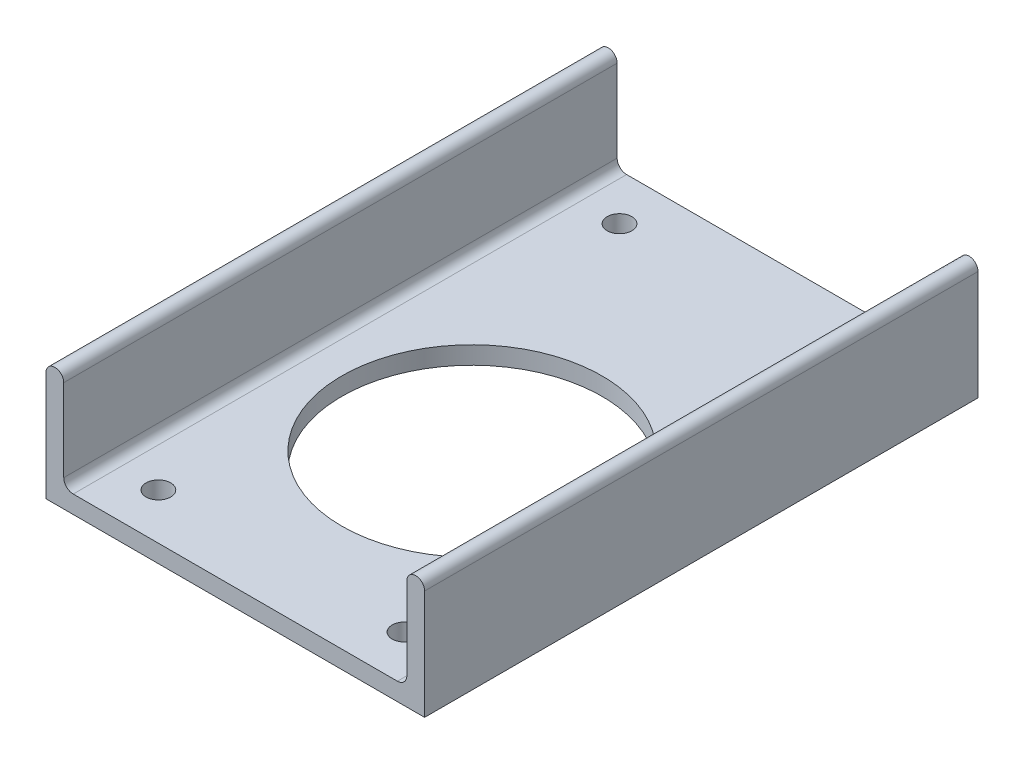
ISO-10303-21;
HEADER;
FILE_DESCRIPTION(('STEP AP214'),'2;1');
FILE_NAME('part.step','',(''),(''),'','','');
FILE_SCHEMA(('AUTOMOTIVE_DESIGN { 1 0 10303 214 1 1 1 1 }'));
ENDSEC;
DATA;
#1=APPLICATION_CONTEXT('core data for automotive mechanical design processes');
#2=APPLICATION_PROTOCOL_DEFINITION('international standard','automotive_design',2000,#1);
#3=PRODUCT_CONTEXT('',#1,'mechanical');
#4=PRODUCT('Part','Part','',(#3));
#5=PRODUCT_RELATED_PRODUCT_CATEGORY('part','',(#4));
#6=PRODUCT_DEFINITION_FORMATION('','',#4);
#7=PRODUCT_DEFINITION_CONTEXT('part definition',#1,'design');
#8=PRODUCT_DEFINITION('design','',#6,#7);
#9=PRODUCT_DEFINITION_SHAPE('','',#8);
#10=(LENGTH_UNIT() NAMED_UNIT(*) SI_UNIT(.MILLI.,.METRE.));
#11=(NAMED_UNIT(*) PLANE_ANGLE_UNIT() SI_UNIT($,.RADIAN.));
#12=(NAMED_UNIT(*) SI_UNIT($,.STERADIAN.) SOLID_ANGLE_UNIT());
#13=UNCERTAINTY_MEASURE_WITH_UNIT(LENGTH_MEASURE(1.E-05),#10,'distance_accuracy_value','');
#14=(GEOMETRIC_REPRESENTATION_CONTEXT(3) GLOBAL_UNCERTAINTY_ASSIGNED_CONTEXT((#13)) GLOBAL_UNIT_ASSIGNED_CONTEXT((#10,
#11,#12)) REPRESENTATION_CONTEXT('',''));
#15=CARTESIAN_POINT('',(0.,0.,0.));
#16=DIRECTION('',(0.,0.,1.));
#17=DIRECTION('',(1.,0.,0.));
#18=AXIS2_PLACEMENT_3D('',#15,#16,#17);
#19=CARTESIAN_POINT('',(-48.41875,29.36875,0.));
#20=DIRECTION('',(0.,0.,-1.));
#21=DIRECTION('',(-1.,0.,0.));
#22=AXIS2_PLACEMENT_3D('',#19,#20,#21);
#23=CYLINDRICAL_SURFACE('',#22,2.38125);
#24=DIRECTION('',(0.,0.,1.));
#25=VECTOR('',#24,1.);
#26=CARTESIAN_POINT('',(-46.0375,29.36875,0.));
#27=LINE('',#26,#25);
#28=CARTESIAN_POINT('',(-46.0375,29.36875,-74.25436));
#29=VERTEX_POINT('',#28);
#30=CARTESIAN_POINT('',(-46.0375,29.36875,74.25436));
#31=VERTEX_POINT('',#30);
#32=EDGE_CURVE('E227',#29,#31,#27,.T.);
#33=ORIENTED_EDGE('',*,*,#32,.F.);
#34=CARTESIAN_POINT('',(-48.41875,29.36875,-74.25436));
#35=DIRECTION('',(0.,0.,-1.));
#36=DIRECTION('',(-1.,0.,0.));
#37=AXIS2_PLACEMENT_3D('',#34,#35,#36);
#38=CIRCLE('',#37,2.38125);
#39=CARTESIAN_POINT('',(-50.8,29.36875,-74.25436));
#40=VERTEX_POINT('',#39);
#41=EDGE_CURVE('E204',#29,#40,#38,.F.);
#42=ORIENTED_EDGE('',*,*,#41,.T.);
#43=DIRECTION('',(0.,0.,-1.));
#44=VECTOR('',#43,1.);
#45=CARTESIAN_POINT('',(-50.8,29.36875,74.25436));
#46=LINE('',#45,#44);
#47=CARTESIAN_POINT('',(-50.8,29.36875,74.25436));
#48=VERTEX_POINT('',#47);
#49=EDGE_CURVE('E231',#48,#40,#46,.T.);
#50=ORIENTED_EDGE('',*,*,#49,.F.);
#51=CARTESIAN_POINT('',(-48.41875,29.36875,74.25436));
#52=DIRECTION('',(0.,0.,-1.));
#53=DIRECTION('',(-1.,0.,0.));
#54=AXIS2_PLACEMENT_3D('',#51,#52,#53);
#55=CIRCLE('',#54,2.38125);
#56=EDGE_CURVE('E234',#31,#48,#55,.F.);
#57=ORIENTED_EDGE('',*,*,#56,.F.);
#58=EDGE_LOOP('',(#33,#42,#50,#57));
#59=FACE_BOUND('',#58,.T.);
#60=ADVANCED_FACE('F48',(#59),#23,.T.);
#61=CARTESIAN_POINT('',(-46.0375,0.,74.25436));
#62=DIRECTION('',(-1.,0.,0.));
#63=DIRECTION('',(0.,0.,1.));
#64=AXIS2_PLACEMENT_3D('',#61,#62,#63);
#65=PLANE('',#64);
#66=DIRECTION('',(0.,1.,0.));
#67=VECTOR('',#66,1.);
#68=CARTESIAN_POINT('',(-46.0375,0.,74.25436));
#69=LINE('',#68,#67);
#70=CARTESIAN_POINT('',(-46.0375,7.3025,74.25436));
#71=VERTEX_POINT('',#70);
#72=EDGE_CURVE('E212',#71,#31,#69,.T.);
#73=ORIENTED_EDGE('',*,*,#72,.F.);
#74=DIRECTION('',(0.,0.,-1.));
#75=VECTOR('',#74,1.);
#76=CARTESIAN_POINT('',(-46.0375,7.3025,0.));
#77=LINE('',#76,#75);
#78=CARTESIAN_POINT('',(-46.0375,7.3025,-74.25436));
#79=VERTEX_POINT('',#78);
#80=EDGE_CURVE('E237',#71,#79,#77,.T.);
#81=ORIENTED_EDGE('',*,*,#80,.T.);
#82=DIRECTION('',(0.,1.,0.));
#83=VECTOR('',#82,1.);
#84=CARTESIAN_POINT('',(-46.0375,0.,-74.25436));
#85=LINE('',#84,#83);
#86=EDGE_CURVE('E196',#79,#29,#85,.T.);
#87=ORIENTED_EDGE('',*,*,#86,.T.);
#88=ORIENTED_EDGE('',*,*,#32,.T.);
#89=EDGE_LOOP('',(#73,#81,#87,#88));
#90=FACE_BOUND('',#89,.T.);
#91=ADVANCED_FACE('F290',(#90),#65,.F.);
#92=CARTESIAN_POINT('',(-50.8,0.,74.25436));
#93=DIRECTION('',(-1.,0.,0.));
#94=DIRECTION('',(0.,0.,1.));
#95=AXIS2_PLACEMENT_3D('',#92,#93,#94);
#96=PLANE('',#95);
#97=DIRECTION('',(0.,1.,0.));
#98=VECTOR('',#97,1.);
#99=CARTESIAN_POINT('',(-50.8,0.,74.25436));
#100=LINE('',#99,#98);
#101=CARTESIAN_POINT('',(-50.8,0.,74.25436));
#102=VERTEX_POINT('',#101);
#103=EDGE_CURVE('E215',#102,#48,#100,.T.);
#104=ORIENTED_EDGE('',*,*,#103,.T.);
#105=ORIENTED_EDGE('',*,*,#49,.T.);
#106=DIRECTION('',(0.,1.,0.));
#107=VECTOR('',#106,1.);
#108=CARTESIAN_POINT('',(-50.8,0.,-74.25436));
#109=LINE('',#108,#107);
#110=CARTESIAN_POINT('',(-50.8,0.,-74.25436));
#111=VERTEX_POINT('',#110);
#112=EDGE_CURVE('E138',#111,#40,#109,.T.);
#113=ORIENTED_EDGE('',*,*,#112,.F.);
#114=DIRECTION('',(0.,0.,-1.));
#115=VECTOR('',#114,1.);
#116=CARTESIAN_POINT('',(-50.8,0.,74.25436));
#117=LINE('',#116,#115);
#118=EDGE_CURVE('E131',#102,#111,#117,.T.);
#119=ORIENTED_EDGE('',*,*,#118,.F.);
#120=EDGE_LOOP('',(#104,#105,#113,#119));
#121=FACE_BOUND('',#120,.T.);
#122=ADVANCED_FACE('F295',(#121),#96,.T.);
#123=CARTESIAN_POINT('',(0.,0.,74.25436));
#124=DIRECTION('',(0.,-1.,0.));
#125=DIRECTION('',(0.,0.,-1.));
#126=AXIS2_PLACEMENT_3D('',#123,#124,#125);
#127=PLANE('',#126);
#128=CARTESIAN_POINT('',(0.,0.,10.75436));
#129=DIRECTION('',(0.,1.,0.));
#130=DIRECTION('',(0.,0.,1.));
#131=AXIS2_PLACEMENT_3D('',#128,#129,#130);
#132=CIRCLE('',#131,34.925);
#133=CARTESIAN_POINT('',(0.,0.,45.67936));
#134=VERTEX_POINT('',#133);
#135=EDGE_CURVE('E500',#134,#134,#132,.T.);
#136=ORIENTED_EDGE('',*,*,#135,.T.);
#137=EDGE_LOOP('',(#136));
#138=FACE_BOUND('',#137,.T.);
#139=CARTESIAN_POINT('',(-33.02,0.,61.87186));
#140=DIRECTION('',(0.,-1.,0.));
#141=DIRECTION('',(0.,0.,-1.));
#142=AXIS2_PLACEMENT_3D('',#139,#140,#141);
#143=CIRCLE('',#142,3.29999999999999);
#144=CARTESIAN_POINT('',(-33.02,0.,58.57186));
#145=VERTEX_POINT('',#144);
#146=EDGE_CURVE('E509',#145,#145,#143,.T.);
#147=ORIENTED_EDGE('',*,*,#146,.F.);
#148=EDGE_LOOP('',(#147));
#149=FACE_BOUND('',#148,.T.);
#150=CARTESIAN_POINT('',(33.02,0.,61.87186));
#151=DIRECTION('',(0.,-1.,0.));
#152=DIRECTION('',(0.,0.,-1.));
#153=AXIS2_PLACEMENT_3D('',#150,#151,#152);
#154=CIRCLE('',#153,3.29999999999999);
#155=CARTESIAN_POINT('',(33.02,0.,58.57186));
#156=VERTEX_POINT('',#155);
#157=EDGE_CURVE('E264',#156,#156,#154,.T.);
#158=ORIENTED_EDGE('',*,*,#157,.F.);
#159=EDGE_LOOP('',(#158));
#160=FACE_BOUND('',#159,.T.);
#161=CARTESIAN_POINT('',(-33.02,0.,-61.87186));
#162=DIRECTION('',(0.,-1.,0.));
#163=DIRECTION('',(0.,0.,-1.));
#164=AXIS2_PLACEMENT_3D('',#161,#162,#163);
#165=CIRCLE('',#164,3.29999999999999);
#166=CARTESIAN_POINT('',(-33.02,0.,-65.17186));
#167=VERTEX_POINT('',#166);
#168=EDGE_CURVE('E245',#167,#167,#165,.T.);
#169=ORIENTED_EDGE('',*,*,#168,.F.);
#170=EDGE_LOOP('',(#169));
#171=FACE_BOUND('',#170,.T.);
#172=CARTESIAN_POINT('',(33.02,0.,-61.87186));
#173=DIRECTION('',(0.,-1.,0.));
#174=DIRECTION('',(0.,0.,-1.));
#175=AXIS2_PLACEMENT_3D('',#172,#173,#174);
#176=CIRCLE('',#175,3.29999999999999);
#177=CARTESIAN_POINT('',(33.02,0.,-65.17186));
#178=VERTEX_POINT('',#177);
#179=EDGE_CURVE('E244',#178,#178,#176,.T.);
#180=ORIENTED_EDGE('',*,*,#179,.F.);
#181=EDGE_LOOP('',(#180));
#182=FACE_BOUND('',#181,.T.);
#183=ORIENTED_EDGE('',*,*,#118,.T.);
#184=DIRECTION('',(-1.,0.,0.));
#185=VECTOR('',#184,1.);
#186=CARTESIAN_POINT('',(0.,0.,-74.25436));
#187=LINE('',#186,#185);
#188=CARTESIAN_POINT('',(50.8,0.,-74.25436));
#189=VERTEX_POINT('',#188);
#190=EDGE_CURVE('E125',#189,#111,#187,.T.);
#191=ORIENTED_EDGE('',*,*,#190,.F.);
#192=DIRECTION('',(0.,0.,-1.));
#193=VECTOR('',#192,1.);
#194=CARTESIAN_POINT('',(50.8,0.,74.25436));
#195=LINE('',#194,#193);
#196=CARTESIAN_POINT('',(50.8,0.,74.25436));
#197=VERTEX_POINT('',#196);
#198=EDGE_CURVE('E129',#197,#189,#195,.T.);
#199=ORIENTED_EDGE('',*,*,#198,.F.);
#200=DIRECTION('',(-1.,0.,0.));
#201=VECTOR('',#200,1.);
#202=CARTESIAN_POINT('',(0.,0.,74.25436));
#203=LINE('',#202,#201);
#204=EDGE_CURVE('E219',#197,#102,#203,.T.);
#205=ORIENTED_EDGE('',*,*,#204,.T.);
#206=EDGE_LOOP('',(#183,#191,#199,#205));
#207=FACE_BOUND('',#206,.T.);
#208=ADVANCED_FACE('F127',(#138,#149,#160,#171,#182,#207),#127,.T.);
#209=CARTESIAN_POINT('',(0.,4.7625,74.25436));
#210=DIRECTION('',(0.,-1.,0.));
#211=DIRECTION('',(0.,0.,-1.));
#212=AXIS2_PLACEMENT_3D('',#209,#210,#211);
#213=PLANE('',#212);
#214=CARTESIAN_POINT('',(0.,4.7625,10.75436));
#215=DIRECTION('',(0.,1.,0.));
#216=DIRECTION('',(0.,0.,1.));
#217=AXIS2_PLACEMENT_3D('',#214,#215,#216);
#218=CIRCLE('',#217,34.925);
#219=CARTESIAN_POINT('',(0.,4.7625,45.67936));
#220=VERTEX_POINT('',#219);
#221=EDGE_CURVE('E503',#220,#220,#218,.T.);
#222=ORIENTED_EDGE('',*,*,#221,.F.);
#223=EDGE_LOOP('',(#222));
#224=FACE_BOUND('',#223,.T.);
#225=CARTESIAN_POINT('',(-33.02,4.7625,61.87186));
#226=DIRECTION('',(0.,-1.,0.));
#227=DIRECTION('',(0.,0.,-1.));
#228=AXIS2_PLACEMENT_3D('',#225,#226,#227);
#229=CIRCLE('',#228,3.29999999999999);
#230=CARTESIAN_POINT('',(-33.02,4.7625,58.57186));
#231=VERTEX_POINT('',#230);
#232=EDGE_CURVE('E52',#231,#231,#229,.T.);
#233=ORIENTED_EDGE('',*,*,#232,.T.);
#234=EDGE_LOOP('',(#233));
#235=FACE_BOUND('',#234,.T.);
#236=CARTESIAN_POINT('',(33.02,4.7625,61.87186));
#237=DIRECTION('',(0.,-1.,0.));
#238=DIRECTION('',(0.,0.,-1.));
#239=AXIS2_PLACEMENT_3D('',#236,#237,#238);
#240=CIRCLE('',#239,3.29999999999999);
#241=CARTESIAN_POINT('',(33.02,4.7625,58.57186));
#242=VERTEX_POINT('',#241);
#243=EDGE_CURVE('E255',#242,#242,#240,.T.);
#244=ORIENTED_EDGE('',*,*,#243,.T.);
#245=EDGE_LOOP('',(#244));
#246=FACE_BOUND('',#245,.T.);
#247=CARTESIAN_POINT('',(-33.02,4.7625,-61.87186));
#248=DIRECTION('',(0.,-1.,0.));
#249=DIRECTION('',(0.,0.,-1.));
#250=AXIS2_PLACEMENT_3D('',#247,#248,#249);
#251=CIRCLE('',#250,3.29999999999999);
#252=CARTESIAN_POINT('',(-33.02,4.7625,-65.17186));
#253=VERTEX_POINT('',#252);
#254=EDGE_CURVE('E241',#253,#253,#251,.T.);
#255=ORIENTED_EDGE('',*,*,#254,.T.);
#256=EDGE_LOOP('',(#255));
#257=FACE_BOUND('',#256,.T.);
#258=CARTESIAN_POINT('',(33.02,4.7625,-61.87186));
#259=DIRECTION('',(0.,-1.,0.));
#260=DIRECTION('',(0.,0.,-1.));
#261=AXIS2_PLACEMENT_3D('',#258,#259,#260);
#262=CIRCLE('',#261,3.29999999999999);
#263=CARTESIAN_POINT('',(33.02,4.7625,-65.17186));
#264=VERTEX_POINT('',#263);
#265=EDGE_CURVE('E165',#264,#264,#262,.T.);
#266=ORIENTED_EDGE('',*,*,#265,.T.);
#267=EDGE_LOOP('',(#266));
#268=FACE_BOUND('',#267,.T.);
#269=DIRECTION('',(1.,0.,0.));
#270=VECTOR('',#269,1.);
#271=CARTESIAN_POINT('',(0.,4.7625,74.25436));
#272=LINE('',#271,#270);
#273=CARTESIAN_POINT('',(43.4975,4.7625,74.25436));
#274=VERTEX_POINT('',#273);
#275=CARTESIAN_POINT('',(-43.4975,4.7625,74.25436));
#276=VERTEX_POINT('',#275);
#277=EDGE_CURVE('E222',#274,#276,#272,.F.);
#278=ORIENTED_EDGE('',*,*,#277,.F.);
#279=DIRECTION('',(0.,0.,-1.));
#280=VECTOR('',#279,1.);
#281=CARTESIAN_POINT('',(43.4975,4.7625,74.25436));
#282=LINE('',#281,#280);
#283=CARTESIAN_POINT('',(43.4975,4.7625,-74.25436));
#284=VERTEX_POINT('',#283);
#285=EDGE_CURVE('E189',#284,#274,#282,.F.);
#286=ORIENTED_EDGE('',*,*,#285,.F.);
#287=DIRECTION('',(1.,0.,0.));
#288=VECTOR('',#287,1.);
#289=CARTESIAN_POINT('',(0.,4.7625,-74.25436));
#290=LINE('',#289,#288);
#291=CARTESIAN_POINT('',(-43.4975,4.7625,-74.25436));
#292=VERTEX_POINT('',#291);
#293=EDGE_CURVE('E137',#284,#292,#290,.F.);
#294=ORIENTED_EDGE('',*,*,#293,.T.);
#295=DIRECTION('',(0.,0.,-1.));
#296=VECTOR('',#295,1.);
#297=CARTESIAN_POINT('',(-43.4975,4.7625,74.25436));
#298=LINE('',#297,#296);
#299=EDGE_CURVE('E58',#292,#276,#298,.F.);
#300=ORIENTED_EDGE('',*,*,#299,.T.);
#301=EDGE_LOOP('',(#278,#286,#294,#300));
#302=FACE_BOUND('',#301,.T.);
#303=ADVANCED_FACE('F272',(#224,#235,#246,#257,#268,#302),#213,.F.);
#304=CARTESIAN_POINT('',(0.,0.,74.25436));
#305=DIRECTION('',(0.,0.,-1.));
#306=DIRECTION('',(-1.,0.,0.));
#307=AXIS2_PLACEMENT_3D('',#304,#305,#306);
#308=PLANE('',#307);
#309=ORIENTED_EDGE('',*,*,#277,.T.);
#310=CARTESIAN_POINT('',(-43.4975,7.3025,74.25436));
#311=DIRECTION('',(0.,0.,-1.));
#312=DIRECTION('',(-1.,0.,0.));
#313=AXIS2_PLACEMENT_3D('',#310,#311,#312);
#314=CIRCLE('',#313,2.54);
#315=EDGE_CURVE('E11',#276,#71,#314,.T.);
#316=ORIENTED_EDGE('',*,*,#315,.T.);
#317=ORIENTED_EDGE('',*,*,#72,.T.);
#318=ORIENTED_EDGE('',*,*,#56,.T.);
#319=ORIENTED_EDGE('',*,*,#103,.F.);
#320=ORIENTED_EDGE('',*,*,#204,.F.);
#321=DIRECTION('',(0.,1.,0.));
#322=VECTOR('',#321,1.);
#323=CARTESIAN_POINT('',(50.8,0.,74.25436));
#324=LINE('',#323,#322);
#325=CARTESIAN_POINT('',(50.8,29.36875,74.25436));
#326=VERTEX_POINT('',#325);
#327=EDGE_CURVE('E146',#197,#326,#324,.T.);
#328=ORIENTED_EDGE('',*,*,#327,.T.);
#329=CARTESIAN_POINT('',(48.41875,29.36875,74.25436));
#330=DIRECTION('',(0.,0.,1.));
#331=DIRECTION('',(1.,0.,0.));
#332=AXIS2_PLACEMENT_3D('',#329,#330,#331);
#333=CIRCLE('',#332,2.38125);
#334=CARTESIAN_POINT('',(46.0375,29.36875,74.25436));
#335=VERTEX_POINT('',#334);
#336=EDGE_CURVE('E182',#335,#326,#333,.F.);
#337=ORIENTED_EDGE('',*,*,#336,.F.);
#338=DIRECTION('',(0.,1.,0.));
#339=VECTOR('',#338,1.);
#340=CARTESIAN_POINT('',(46.0375,0.,74.25436));
#341=LINE('',#340,#339);
#342=CARTESIAN_POINT('',(46.0375,7.3025,74.25436));
#343=VERTEX_POINT('',#342);
#344=EDGE_CURVE('E172',#343,#335,#341,.T.);
#345=ORIENTED_EDGE('',*,*,#344,.F.);
#346=CARTESIAN_POINT('',(43.4975,7.3025,74.25436));
#347=DIRECTION('',(0.,0.,1.));
#348=DIRECTION('',(1.,0.,0.));
#349=AXIS2_PLACEMENT_3D('',#346,#347,#348);
#350=CIRCLE('',#349,2.54);
#351=EDGE_CURVE('E193',#274,#343,#350,.T.);
#352=ORIENTED_EDGE('',*,*,#351,.F.);
#353=EDGE_LOOP('',(#309,#316,#317,#318,#319,#320,#328,#337,#345,#352));
#354=FACE_BOUND('',#353,.T.);
#355=ADVANCED_FACE('F310',(#354),#308,.F.);
#356=CARTESIAN_POINT('',(-43.4975,7.3025,74.25436));
#357=DIRECTION('',(0.,0.,1.));
#358=DIRECTION('',(1.,0.,0.));
#359=AXIS2_PLACEMENT_3D('',#356,#357,#358);
#360=CYLINDRICAL_SURFACE('',#359,2.54);
#361=ORIENTED_EDGE('',*,*,#315,.F.);
#362=ORIENTED_EDGE('',*,*,#299,.F.);
#363=CARTESIAN_POINT('',(-43.4975,7.3025,-74.25436));
#364=DIRECTION('',(0.,0.,-1.));
#365=DIRECTION('',(-1.,0.,0.));
#366=AXIS2_PLACEMENT_3D('',#363,#364,#365);
#367=CIRCLE('',#366,2.54);
#368=EDGE_CURVE('E208',#292,#79,#367,.T.);
#369=ORIENTED_EDGE('',*,*,#368,.T.);
#370=ORIENTED_EDGE('',*,*,#80,.F.);
#371=EDGE_LOOP('',(#361,#362,#369,#370));
#372=FACE_BOUND('',#371,.T.);
#373=ADVANCED_FACE('F50',(#372),#360,.F.);
#374=CARTESIAN_POINT('',(0.,0.,-74.25436));
#375=DIRECTION('',(0.,0.,1.));
#376=DIRECTION('',(-1.,0.,0.));
#377=AXIS2_PLACEMENT_3D('',#374,#375,#376);
#378=PLANE('',#377);
#379=ORIENTED_EDGE('',*,*,#293,.F.);
#380=CARTESIAN_POINT('',(43.4975,7.3025,-74.25436));
#381=DIRECTION('',(0.,0.,1.));
#382=DIRECTION('',(1.,0.,0.));
#383=AXIS2_PLACEMENT_3D('',#380,#381,#382);
#384=CIRCLE('',#383,2.54);
#385=CARTESIAN_POINT('',(46.0375,7.3025,-74.25436));
#386=VERTEX_POINT('',#385);
#387=EDGE_CURVE('E162',#284,#386,#384,.T.);
#388=ORIENTED_EDGE('',*,*,#387,.T.);
#389=DIRECTION('',(0.,1.,0.));
#390=VECTOR('',#389,1.);
#391=CARTESIAN_POINT('',(46.0375,0.,-74.25436));
#392=LINE('',#391,#390);
#393=CARTESIAN_POINT('',(46.0375,29.36875,-74.25436));
#394=VERTEX_POINT('',#393);
#395=EDGE_CURVE('E155',#386,#394,#392,.T.);
#396=ORIENTED_EDGE('',*,*,#395,.T.);
#397=CARTESIAN_POINT('',(48.41875,29.36875,-74.25436));
#398=DIRECTION('',(0.,0.,1.));
#399=DIRECTION('',(1.,0.,0.));
#400=AXIS2_PLACEMENT_3D('',#397,#398,#399);
#401=CIRCLE('',#400,2.38125);
#402=CARTESIAN_POINT('',(50.8,29.36875,-74.25436));
#403=VERTEX_POINT('',#402);
#404=EDGE_CURVE('E153',#394,#403,#401,.F.);
#405=ORIENTED_EDGE('',*,*,#404,.T.);
#406=DIRECTION('',(0.,1.,0.));
#407=VECTOR('',#406,1.);
#408=CARTESIAN_POINT('',(50.8,0.,-74.25436));
#409=LINE('',#408,#407);
#410=EDGE_CURVE('E144',#189,#403,#409,.T.);
#411=ORIENTED_EDGE('',*,*,#410,.F.);
#412=ORIENTED_EDGE('',*,*,#190,.T.);
#413=ORIENTED_EDGE('',*,*,#112,.T.);
#414=ORIENTED_EDGE('',*,*,#41,.F.);
#415=ORIENTED_EDGE('',*,*,#86,.F.);
#416=ORIENTED_EDGE('',*,*,#368,.F.);
#417=EDGE_LOOP('',(#379,#388,#396,#405,#411,#412,#413,#414,#415,#416));
#418=FACE_BOUND('',#417,.T.);
#419=ADVANCED_FACE('F150',(#418),#378,.F.);
#420=CARTESIAN_POINT('',(48.41875,29.36875,0.));
#421=DIRECTION('',(0.,0.,-1.));
#422=DIRECTION('',(1.,0.,0.));
#423=AXIS2_PLACEMENT_3D('',#420,#421,#422);
#424=CYLINDRICAL_SURFACE('',#423,2.38125);
#425=DIRECTION('',(0.,0.,1.));
#426=VECTOR('',#425,1.);
#427=CARTESIAN_POINT('',(46.0375,29.36875,0.));
#428=LINE('',#427,#426);
#429=EDGE_CURVE('E148',#394,#335,#428,.T.);
#430=ORIENTED_EDGE('',*,*,#429,.T.);
#431=ORIENTED_EDGE('',*,*,#336,.T.);
#432=DIRECTION('',(0.,0.,-1.));
#433=VECTOR('',#432,1.);
#434=CARTESIAN_POINT('',(50.8,29.36875,74.25436));
#435=LINE('',#434,#433);
#436=EDGE_CURVE('E179',#326,#403,#435,.T.);
#437=ORIENTED_EDGE('',*,*,#436,.T.);
#438=ORIENTED_EDGE('',*,*,#404,.F.);
#439=EDGE_LOOP('',(#430,#431,#437,#438));
#440=FACE_BOUND('',#439,.T.);
#441=ADVANCED_FACE('F315',(#440),#424,.T.);
#442=CARTESIAN_POINT('',(46.0375,0.,74.25436));
#443=DIRECTION('',(1.,0.,0.));
#444=DIRECTION('',(0.,0.,1.));
#445=AXIS2_PLACEMENT_3D('',#442,#443,#444);
#446=PLANE('',#445);
#447=ORIENTED_EDGE('',*,*,#344,.T.);
#448=ORIENTED_EDGE('',*,*,#429,.F.);
#449=ORIENTED_EDGE('',*,*,#395,.F.);
#450=DIRECTION('',(0.,0.,-1.));
#451=VECTOR('',#450,1.);
#452=CARTESIAN_POINT('',(46.0375,7.3025,0.));
#453=LINE('',#452,#451);
#454=EDGE_CURVE('E186',#343,#386,#453,.T.);
#455=ORIENTED_EDGE('',*,*,#454,.F.);
#456=EDGE_LOOP('',(#447,#448,#449,#455));
#457=FACE_BOUND('',#456,.T.);
#458=ADVANCED_FACE('F319',(#457),#446,.F.);
#459=CARTESIAN_POINT('',(50.8,0.,74.25436));
#460=DIRECTION('',(1.,0.,0.));
#461=DIRECTION('',(0.,0.,1.));
#462=AXIS2_PLACEMENT_3D('',#459,#460,#461);
#463=PLANE('',#462);
#464=ORIENTED_EDGE('',*,*,#327,.F.);
#465=ORIENTED_EDGE('',*,*,#198,.T.);
#466=ORIENTED_EDGE('',*,*,#410,.T.);
#467=ORIENTED_EDGE('',*,*,#436,.F.);
#468=EDGE_LOOP('',(#464,#465,#466,#467));
#469=FACE_BOUND('',#468,.T.);
#470=ADVANCED_FACE('F142',(#469),#463,.T.);
#471=CARTESIAN_POINT('',(43.4975,7.3025,74.25436));
#472=DIRECTION('',(0.,0.,1.));
#473=DIRECTION('',(-1.,0.,0.));
#474=AXIS2_PLACEMENT_3D('',#471,#472,#473);
#475=CYLINDRICAL_SURFACE('',#474,2.54);
#476=ORIENTED_EDGE('',*,*,#351,.T.);
#477=ORIENTED_EDGE('',*,*,#454,.T.);
#478=ORIENTED_EDGE('',*,*,#387,.F.);
#479=ORIENTED_EDGE('',*,*,#285,.T.);
#480=EDGE_LOOP('',(#476,#477,#478,#479));
#481=FACE_BOUND('',#480,.T.);
#482=ADVANCED_FACE('F277',(#481),#475,.F.);
#483=CARTESIAN_POINT('',(33.02,0.,-61.87186));
#484=DIRECTION('',(0.,-1.,0.));
#485=DIRECTION('',(0.,0.,-1.));
#486=AXIS2_PLACEMENT_3D('',#483,#484,#485);
#487=CYLINDRICAL_SURFACE('',#486,3.29999999999999);
#488=ORIENTED_EDGE('',*,*,#179,.T.);
#489=EDGE_LOOP('',(#488));
#490=FACE_BOUND('',#489,.T.);
#491=ORIENTED_EDGE('',*,*,#265,.F.);
#492=EDGE_LOOP('',(#491));
#493=FACE_BOUND('',#492,.T.);
#494=ADVANCED_FACE('F274',(#490,#493),#487,.F.);
#495=CARTESIAN_POINT('',(-33.02,0.,-61.87186));
#496=DIRECTION('',(0.,-1.,0.));
#497=DIRECTION('',(0.,0.,-1.));
#498=AXIS2_PLACEMENT_3D('',#495,#496,#497);
#499=CYLINDRICAL_SURFACE('',#498,3.29999999999999);
#500=ORIENTED_EDGE('',*,*,#168,.T.);
#501=EDGE_LOOP('',(#500));
#502=FACE_BOUND('',#501,.T.);
#503=ORIENTED_EDGE('',*,*,#254,.F.);
#504=EDGE_LOOP('',(#503));
#505=FACE_BOUND('',#504,.T.);
#506=ADVANCED_FACE('F276',(#502,#505),#499,.F.);
#507=CARTESIAN_POINT('',(33.02,0.,61.87186));
#508=DIRECTION('',(0.,-1.,0.));
#509=DIRECTION('',(0.,0.,-1.));
#510=AXIS2_PLACEMENT_3D('',#507,#508,#509);
#511=CYLINDRICAL_SURFACE('',#510,3.29999999999999);
#512=ORIENTED_EDGE('',*,*,#157,.T.);
#513=EDGE_LOOP('',(#512));
#514=FACE_BOUND('',#513,.T.);
#515=ORIENTED_EDGE('',*,*,#243,.F.);
#516=EDGE_LOOP('',(#515));
#517=FACE_BOUND('',#516,.T.);
#518=ADVANCED_FACE('F284',(#514,#517),#511,.F.);
#519=CARTESIAN_POINT('',(-33.02,0.,61.87186));
#520=DIRECTION('',(0.,-1.,0.));
#521=DIRECTION('',(0.,0.,-1.));
#522=AXIS2_PLACEMENT_3D('',#519,#520,#521);
#523=CYLINDRICAL_SURFACE('',#522,3.29999999999999);
#524=ORIENTED_EDGE('',*,*,#146,.T.);
#525=EDGE_LOOP('',(#524));
#526=FACE_BOUND('',#525,.T.);
#527=ORIENTED_EDGE('',*,*,#232,.F.);
#528=EDGE_LOOP('',(#527));
#529=FACE_BOUND('',#528,.T.);
#530=ADVANCED_FACE('F356',(#526,#529),#523,.F.);
#531=CARTESIAN_POINT('',(0.,0.,10.75436));
#532=DIRECTION('',(0.,1.,0.));
#533=DIRECTION('',(0.,0.,1.));
#534=AXIS2_PLACEMENT_3D('',#531,#532,#533);
#535=CYLINDRICAL_SURFACE('',#534,34.925);
#536=CARTESIAN_POINT('',(0.,0.,45.67936));
#537=CARTESIAN_POINT('',(0.,0.0496093749999991,45.67936));
#538=CARTESIAN_POINT('',(0.,0.0992187499999991,45.67936));
#539=CARTESIAN_POINT('',(0.,0.198437499999999,45.67936));
#540=CARTESIAN_POINT('',(0.,0.248046874999999,45.67936));
#541=CARTESIAN_POINT('',(0.,0.347265624999999,45.67936));
#542=CARTESIAN_POINT('',(0.,0.396874999999999,45.67936));
#543=CARTESIAN_POINT('',(0.,0.496093749999999,45.67936));
#544=CARTESIAN_POINT('',(0.,0.545703124999999,45.67936));
#545=CARTESIAN_POINT('',(0.,0.644921874999999,45.67936));
#546=CARTESIAN_POINT('',(0.,0.694531249999999,45.67936));
#547=CARTESIAN_POINT('',(0.,0.793749999999999,45.67936));
#548=CARTESIAN_POINT('',(0.,0.843359374999999,45.67936));
#549=CARTESIAN_POINT('',(0.,0.942578124999999,45.67936));
#550=CARTESIAN_POINT('',(0.,0.992187499999999,45.67936));
#551=CARTESIAN_POINT('',(0.,1.09140625,45.67936));
#552=CARTESIAN_POINT('',(0.,1.141015625,45.67936));
#553=CARTESIAN_POINT('',(0.,1.240234375,45.67936));
#554=CARTESIAN_POINT('',(0.,1.28984375,45.67936));
#555=CARTESIAN_POINT('',(0.,1.3890625,45.67936));
#556=CARTESIAN_POINT('',(0.,1.438671875,45.67936));
#557=CARTESIAN_POINT('',(0.,1.537890625,45.67936));
#558=CARTESIAN_POINT('',(0.,1.5875,45.67936));
#559=CARTESIAN_POINT('',(0.,1.68671875,45.67936));
#560=CARTESIAN_POINT('',(0.,1.736328125,45.67936));
#561=CARTESIAN_POINT('',(0.,1.835546875,45.67936));
#562=CARTESIAN_POINT('',(0.,1.88515625,45.67936));
#563=CARTESIAN_POINT('',(0.,1.984375,45.67936));
#564=CARTESIAN_POINT('',(0.,2.033984375,45.67936));
#565=CARTESIAN_POINT('',(0.,2.133203125,45.67936));
#566=CARTESIAN_POINT('',(0.,2.1828125,45.67936));
#567=CARTESIAN_POINT('',(0.,2.28203125,45.67936));
#568=CARTESIAN_POINT('',(0.,2.331640625,45.67936));
#569=CARTESIAN_POINT('',(0.,2.430859375,45.67936));
#570=CARTESIAN_POINT('',(0.,2.48046875,45.67936));
#571=CARTESIAN_POINT('',(0.,2.5796875,45.67936));
#572=CARTESIAN_POINT('',(0.,2.629296875,45.67936));
#573=CARTESIAN_POINT('',(0.,2.728515625,45.67936));
#574=CARTESIAN_POINT('',(0.,2.778125,45.67936));
#575=CARTESIAN_POINT('',(0.,2.87734375,45.67936));
#576=CARTESIAN_POINT('',(0.,2.926953125,45.67936));
#577=CARTESIAN_POINT('',(0.,3.026171875,45.67936));
#578=CARTESIAN_POINT('',(0.,3.07578125,45.67936));
#579=CARTESIAN_POINT('',(0.,3.175,45.67936));
#580=CARTESIAN_POINT('',(0.,3.224609375,45.67936));
#581=CARTESIAN_POINT('',(0.,3.323828125,45.67936));
#582=CARTESIAN_POINT('',(0.,3.3734375,45.67936));
#583=CARTESIAN_POINT('',(0.,3.47265625,45.67936));
#584=CARTESIAN_POINT('',(0.,3.522265625,45.67936));
#585=CARTESIAN_POINT('',(0.,3.621484375,45.67936));
#586=CARTESIAN_POINT('',(0.,3.67109375,45.67936));
#587=CARTESIAN_POINT('',(0.,3.7703125,45.67936));
#588=CARTESIAN_POINT('',(0.,3.819921875,45.67936));
#589=CARTESIAN_POINT('',(0.,3.919140625,45.67936));
#590=CARTESIAN_POINT('',(0.,3.96875,45.67936));
#591=CARTESIAN_POINT('',(0.,4.06796875,45.67936));
#592=CARTESIAN_POINT('',(0.,4.117578125,45.67936));
#593=CARTESIAN_POINT('',(0.,4.216796875,45.67936));
#594=CARTESIAN_POINT('',(0.,4.26640625,45.67936));
#595=CARTESIAN_POINT('',(0.,4.365625,45.67936));
#596=CARTESIAN_POINT('',(0.,4.415234375,45.67936));
#597=CARTESIAN_POINT('',(0.,4.514453125,45.67936));
#598=CARTESIAN_POINT('',(0.,4.5640625,45.67936));
#599=CARTESIAN_POINT('',(0.,4.66328125,45.67936));
#600=CARTESIAN_POINT('',(0.,4.712890625,45.67936));
#601=CARTESIAN_POINT('',(0.,4.7625,45.67936));
#602=B_SPLINE_CURVE_WITH_KNOTS('',3,(#536,#537,#538,#539,#540,#541,#542,#543,#544,#545,#546,
#547,#548,#549,#550,#551,#552,#553,#554,#555,#556,#557,#558,#559,#560,#561,#562,#563,#564,#565,
#566,#567,#568,#569,#570,#571,#572,#573,#574,#575,#576,#577,#578,#579,#580,#581,#582,#583,#584,
#585,#586,#587,#588,#589,#590,#591,#592,#593,#594,#595,#596,#597,#598,#599,#600,#601),
.UNSPECIFIED.,.F.,.F.,(4,2,2,2,2,2,2,2,2,2,2,2,2,2,2,2,2,2,2,2,2,2,2,2,2,2,2,2,2,2,2,2,4),(0.,
0.148828125,0.29765625,0.446484375,0.5953125,0.744140625,0.89296875,1.041796875,1.190625,
1.339453125,1.48828125,1.637109375,1.7859375,1.934765625,2.08359375,2.232421875,2.38125,
2.530078125,2.67890625,2.827734375,2.9765625,3.125390625,3.27421875,3.423046875,3.571875,
3.720703125,3.86953125,4.018359375,4.1671875,4.316015625,4.46484375,4.613671875,4.7625),.UNSPECIFIED.);
#603=EDGE_CURVE('BSEAM366',#134,#220,#602,.T.);
#604=ORIENTED_EDGE('',*,*,#135,.F.);
#605=ORIENTED_EDGE('',*,*,#221,.T.);
#606=ORIENTED_EDGE('',*,*,#603,.T.);
#607=ORIENTED_EDGE('',*,*,#603,.F.);
#608=EDGE_LOOP('',(#604,#606,#605,#607));
#609=FACE_BOUND('',#608,.T.);
#610=ADVANCED_FACE('F366',(#609),#535,.F.);
#611=CLOSED_SHELL('',(#60,#91,#122,#208,#303,#355,#373,#419,#441,#458,#470,#482,#494,#506,#518,
#530,#610));
#612=MANIFOLD_SOLID_BREP('B2',#611);
#613=ADVANCED_BREP_SHAPE_REPRESENTATION('',(#18,#612),#14);
#614=SHAPE_DEFINITION_REPRESENTATION(#9,#613);
ENDSEC;
END-ISO-10303-21;
